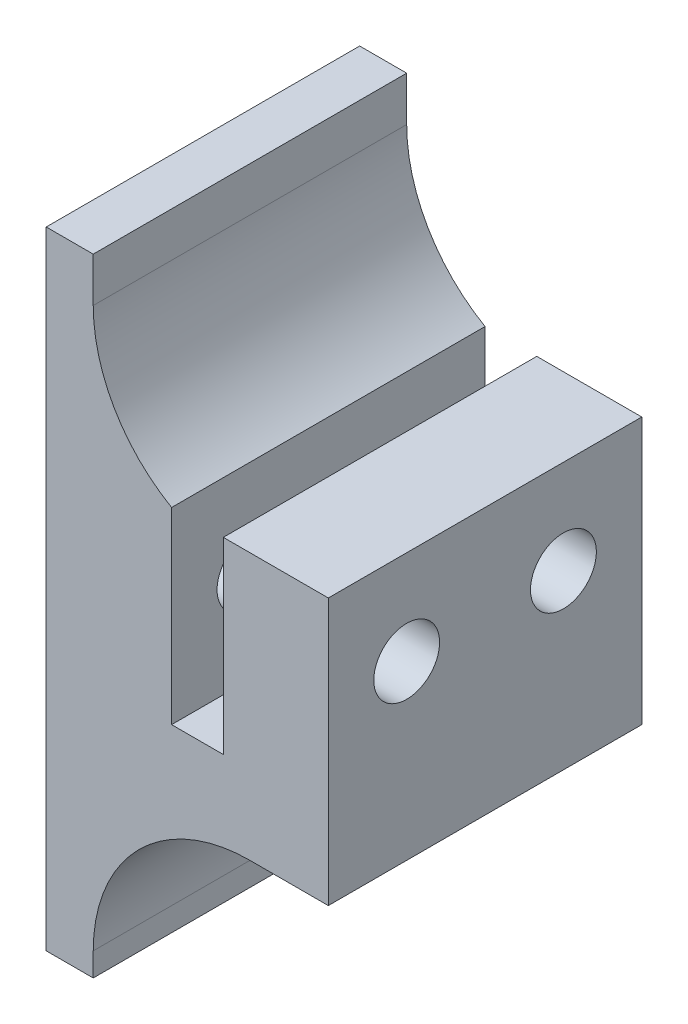
ISO-10303-21;
HEADER;
FILE_DESCRIPTION(('STEP AP214'),'2;1');
FILE_NAME('part.step','',(''),(''),'','','');
FILE_SCHEMA(('AUTOMOTIVE_DESIGN { 1 0 10303 214 1 1 1 1 }'));
ENDSEC;
DATA;
#1=APPLICATION_CONTEXT('core data for automotive mechanical design processes');
#2=APPLICATION_PROTOCOL_DEFINITION('international standard','automotive_design',2000,#1);
#3=PRODUCT_CONTEXT('',#1,'mechanical');
#4=PRODUCT('Part','Part','',(#3));
#5=PRODUCT_RELATED_PRODUCT_CATEGORY('part','',(#4));
#6=PRODUCT_DEFINITION_FORMATION('','',#4);
#7=PRODUCT_DEFINITION_CONTEXT('part definition',#1,'design');
#8=PRODUCT_DEFINITION('design','',#6,#7);
#9=PRODUCT_DEFINITION_SHAPE('','',#8);
#10=(LENGTH_UNIT() NAMED_UNIT(*) SI_UNIT(.MILLI.,.METRE.));
#11=(NAMED_UNIT(*) PLANE_ANGLE_UNIT() SI_UNIT($,.RADIAN.));
#12=(NAMED_UNIT(*) SI_UNIT($,.STERADIAN.) SOLID_ANGLE_UNIT());
#13=UNCERTAINTY_MEASURE_WITH_UNIT(LENGTH_MEASURE(1.E-05),#10,'distance_accuracy_value','');
#14=(GEOMETRIC_REPRESENTATION_CONTEXT(3) GLOBAL_UNCERTAINTY_ASSIGNED_CONTEXT((#13)) GLOBAL_UNIT_ASSIGNED_CONTEXT((#10,
#11,#12)) REPRESENTATION_CONTEXT('',''));
#15=CARTESIAN_POINT('',(0.,0.,0.));
#16=DIRECTION('',(0.,0.,1.));
#17=DIRECTION('',(1.,0.,0.));
#18=AXIS2_PLACEMENT_3D('',#15,#16,#17);
#19=CARTESIAN_POINT('',(0.,0.,20.));
#20=DIRECTION('',(-1.,0.,0.));
#21=DIRECTION('',(0.,-1.,0.));
#22=AXIS2_PLACEMENT_3D('',#19,#20,#21);
#23=PLANE('',#22);
#24=CARTESIAN_POINT('',(0.,-6.,5.));
#25=DIRECTION('',(-1.,0.,0.));
#26=DIRECTION('',(0.,-1.,0.));
#27=AXIS2_PLACEMENT_3D('',#24,#25,#26);
#28=CIRCLE('',#27,2.1);
#29=CARTESIAN_POINT('',(0.,-8.1,5.));
#30=VERTEX_POINT('',#29);
#31=EDGE_CURVE('E186',#30,#30,#28,.T.);
#32=ORIENTED_EDGE('',*,*,#31,.T.);
#33=EDGE_LOOP('',(#32));
#34=FACE_BOUND('',#33,.T.);
#35=CARTESIAN_POINT('',(0.,-6.,15.));
#36=DIRECTION('',(-1.,0.,0.));
#37=DIRECTION('',(0.,-1.,0.));
#38=AXIS2_PLACEMENT_3D('',#35,#36,#37);
#39=CIRCLE('',#38,2.1);
#40=CARTESIAN_POINT('',(0.,-8.1,15.));
#41=VERTEX_POINT('',#40);
#42=EDGE_CURVE('E166',#41,#41,#39,.T.);
#43=ORIENTED_EDGE('',*,*,#42,.T.);
#44=EDGE_LOOP('',(#43));
#45=FACE_BOUND('',#44,.T.);
#46=DIRECTION('',(0.,1.,0.));
#47=VECTOR('',#46,1.);
#48=CARTESIAN_POINT('',(0.,0.,0.));
#49=LINE('',#48,#47);
#50=CARTESIAN_POINT('',(0.,-12.,0.));
#51=VERTEX_POINT('',#50);
#52=CARTESIAN_POINT('',(0.,0.,0.));
#53=VERTEX_POINT('',#52);
#54=EDGE_CURVE('E148',#51,#53,#49,.T.);
#55=ORIENTED_EDGE('',*,*,#54,.T.);
#56=DIRECTION('',(0.,0.,-1.));
#57=VECTOR('',#56,1.);
#58=CARTESIAN_POINT('',(0.,0.,20.));
#59=LINE('',#58,#57);
#60=CARTESIAN_POINT('',(0.,0.,20.));
#61=VERTEX_POINT('',#60);
#62=EDGE_CURVE('E146',#61,#53,#59,.T.);
#63=ORIENTED_EDGE('',*,*,#62,.F.);
#64=DIRECTION('',(0.,1.,0.));
#65=VECTOR('',#64,1.);
#66=CARTESIAN_POINT('',(0.,0.,20.));
#67=LINE('',#66,#65);
#68=CARTESIAN_POINT('',(0.,-12.,20.));
#69=VERTEX_POINT('',#68);
#70=EDGE_CURVE('E134',#69,#61,#67,.T.);
#71=ORIENTED_EDGE('',*,*,#70,.F.);
#72=DIRECTION('',(0.,0.,-1.));
#73=VECTOR('',#72,1.);
#74=CARTESIAN_POINT('',(0.,-12.,20.));
#75=LINE('',#74,#73);
#76=EDGE_CURVE('E208',#69,#51,#75,.T.);
#77=ORIENTED_EDGE('',*,*,#76,.T.);
#78=EDGE_LOOP('',(#55,#63,#71,#77));
#79=FACE_BOUND('',#78,.T.);
#80=ADVANCED_FACE('F41',(#34,#45,#79),#23,.F.);
#81=CARTESIAN_POINT('',(-5.,11.5,20.));
#82=DIRECTION('',(-1.,0.,0.));
#83=DIRECTION('',(0.,0.,1.));
#84=AXIS2_PLACEMENT_3D('',#81,#82,#83);
#85=PLANE('',#84);
#86=DIRECTION('',(0.,1.,0.));
#87=VECTOR('',#86,1.);
#88=CARTESIAN_POINT('',(-5.,11.5,20.));
#89=LINE('',#88,#87);
#90=CARTESIAN_POINT('',(-5.,8.66025403784439,20.));
#91=VERTEX_POINT('',#90);
#92=CARTESIAN_POINT('',(-5.,11.5,20.));
#93=VERTEX_POINT('',#92);
#94=EDGE_CURVE('E142',#91,#93,#89,.T.);
#95=ORIENTED_EDGE('',*,*,#94,.F.);
#96=DIRECTION('',(0.,0.,-1.));
#97=VECTOR('',#96,1.);
#98=CARTESIAN_POINT('',(-5.,8.66025403784439,20.));
#99=LINE('',#98,#97);
#100=CARTESIAN_POINT('',(-5.,8.66025403784439,0.));
#101=VERTEX_POINT('',#100);
#102=EDGE_CURVE('E152',#91,#101,#99,.T.);
#103=ORIENTED_EDGE('',*,*,#102,.T.);
#104=DIRECTION('',(0.,1.,0.));
#105=VECTOR('',#104,1.);
#106=CARTESIAN_POINT('',(-5.,11.5,0.));
#107=LINE('',#106,#105);
#108=CARTESIAN_POINT('',(-5.,11.5,0.));
#109=VERTEX_POINT('',#108);
#110=EDGE_CURVE('E210',#101,#109,#107,.T.);
#111=ORIENTED_EDGE('',*,*,#110,.T.);
#112=DIRECTION('',(0.,0.,-1.));
#113=VECTOR('',#112,1.);
#114=CARTESIAN_POINT('',(-5.,11.5,20.));
#115=LINE('',#114,#113);
#116=EDGE_CURVE('E150',#93,#109,#115,.T.);
#117=ORIENTED_EDGE('',*,*,#116,.F.);
#118=EDGE_LOOP('',(#95,#103,#111,#117));
#119=FACE_BOUND('',#118,.T.);
#120=ADVANCED_FACE('F299',(#119),#85,.F.);
#121=CARTESIAN_POINT('',(-8.,11.5,20.));
#122=DIRECTION('',(0.,-1.,0.));
#123=DIRECTION('',(1.,0.,0.));
#124=AXIS2_PLACEMENT_3D('',#121,#122,#123);
#125=PLANE('',#124);
#126=DIRECTION('',(-1.,0.,0.));
#127=VECTOR('',#126,1.);
#128=CARTESIAN_POINT('',(-8.,11.5,0.));
#129=LINE('',#128,#127);
#130=CARTESIAN_POINT('',(-8.,11.5,0.));
#131=VERTEX_POINT('',#130);
#132=EDGE_CURVE('E212',#109,#131,#129,.T.);
#133=ORIENTED_EDGE('',*,*,#132,.T.);
#134=DIRECTION('',(0.,0.,-1.));
#135=VECTOR('',#134,1.);
#136=CARTESIAN_POINT('',(-8.,11.5,20.));
#137=LINE('',#136,#135);
#138=CARTESIAN_POINT('',(-8.,11.5,20.));
#139=VERTEX_POINT('',#138);
#140=EDGE_CURVE('E249',#139,#131,#137,.T.);
#141=ORIENTED_EDGE('',*,*,#140,.F.);
#142=DIRECTION('',(-1.,0.,0.));
#143=VECTOR('',#142,1.);
#144=CARTESIAN_POINT('',(-8.,11.5,20.));
#145=LINE('',#144,#143);
#146=EDGE_CURVE('E190',#93,#139,#145,.T.);
#147=ORIENTED_EDGE('',*,*,#146,.F.);
#148=ORIENTED_EDGE('',*,*,#116,.T.);
#149=EDGE_LOOP('',(#133,#141,#147,#148));
#150=FACE_BOUND('',#149,.T.);
#151=ADVANCED_FACE('F297',(#150),#125,.F.);
#152=CARTESIAN_POINT('',(-8.,-28.5,20.));
#153=DIRECTION('',(1.,0.,0.));
#154=DIRECTION('',(0.,0.,-1.));
#155=AXIS2_PLACEMENT_3D('',#152,#153,#154);
#156=PLANE('',#155);
#157=CARTESIAN_POINT('',(-8.,-6.,5.));
#158=DIRECTION('',(-1.,0.,0.));
#159=DIRECTION('',(0.,0.,1.));
#160=AXIS2_PLACEMENT_3D('',#157,#158,#159);
#161=CIRCLE('',#160,2.1);
#162=CARTESIAN_POINT('',(-8.,-6.,7.1));
#163=VERTEX_POINT('',#162);
#164=EDGE_CURVE('E173',#163,#163,#161,.T.);
#165=ORIENTED_EDGE('',*,*,#164,.F.);
#166=EDGE_LOOP('',(#165));
#167=FACE_BOUND('',#166,.T.);
#168=CARTESIAN_POINT('',(-8.,-6.,15.));
#169=DIRECTION('',(-1.,0.,0.));
#170=DIRECTION('',(0.,0.,1.));
#171=AXIS2_PLACEMENT_3D('',#168,#169,#170);
#172=CIRCLE('',#171,2.1);
#173=CARTESIAN_POINT('',(-8.,-6.,17.1));
#174=VERTEX_POINT('',#173);
#175=EDGE_CURVE('E178',#174,#174,#172,.T.);
#176=ORIENTED_EDGE('',*,*,#175,.F.);
#177=EDGE_LOOP('',(#176));
#178=FACE_BOUND('',#177,.T.);
#179=DIRECTION('',(0.,-1.,0.));
#180=VECTOR('',#179,1.);
#181=CARTESIAN_POINT('',(-8.,-28.5,0.));
#182=LINE('',#181,#180);
#183=CARTESIAN_POINT('',(-8.,-28.5,0.));
#184=VERTEX_POINT('',#183);
#185=EDGE_CURVE('E214',#131,#184,#182,.T.);
#186=ORIENTED_EDGE('',*,*,#185,.T.);
#187=DIRECTION('',(0.,0.,-1.));
#188=VECTOR('',#187,1.);
#189=CARTESIAN_POINT('',(-8.,-28.5,20.));
#190=LINE('',#189,#188);
#191=CARTESIAN_POINT('',(-8.,-28.5,20.));
#192=VERTEX_POINT('',#191);
#193=EDGE_CURVE('E246',#192,#184,#190,.T.);
#194=ORIENTED_EDGE('',*,*,#193,.F.);
#195=DIRECTION('',(0.,-1.,0.));
#196=VECTOR('',#195,1.);
#197=CARTESIAN_POINT('',(-8.,-28.5,20.));
#198=LINE('',#197,#196);
#199=EDGE_CURVE('E192',#139,#192,#198,.T.);
#200=ORIENTED_EDGE('',*,*,#199,.F.);
#201=ORIENTED_EDGE('',*,*,#140,.T.);
#202=EDGE_LOOP('',(#186,#194,#200,#201));
#203=FACE_BOUND('',#202,.T.);
#204=ADVANCED_FACE('F293',(#167,#178,#203),#156,.F.);
#205=CARTESIAN_POINT('',(-5.,-28.5,20.));
#206=DIRECTION('',(0.,1.,0.));
#207=DIRECTION('',(0.,0.,1.));
#208=AXIS2_PLACEMENT_3D('',#205,#206,#207);
#209=PLANE('',#208);
#210=DIRECTION('',(1.,0.,0.));
#211=VECTOR('',#210,1.);
#212=CARTESIAN_POINT('',(-5.,-28.5,0.));
#213=LINE('',#212,#211);
#214=CARTESIAN_POINT('',(-5.,-28.5,0.));
#215=VERTEX_POINT('',#214);
#216=EDGE_CURVE('E216',#184,#215,#213,.T.);
#217=ORIENTED_EDGE('',*,*,#216,.T.);
#218=DIRECTION('',(0.,0.,-1.));
#219=VECTOR('',#218,1.);
#220=CARTESIAN_POINT('',(-5.,-28.5,20.));
#221=LINE('',#220,#219);
#222=CARTESIAN_POINT('',(-5.,-28.5,20.));
#223=VERTEX_POINT('',#222);
#224=EDGE_CURVE('E243',#223,#215,#221,.T.);
#225=ORIENTED_EDGE('',*,*,#224,.F.);
#226=DIRECTION('',(1.,0.,0.));
#227=VECTOR('',#226,1.);
#228=CARTESIAN_POINT('',(-5.,-28.5,20.));
#229=LINE('',#228,#227);
#230=EDGE_CURVE('E194',#192,#223,#229,.T.);
#231=ORIENTED_EDGE('',*,*,#230,.F.);
#232=ORIENTED_EDGE('',*,*,#193,.T.);
#233=EDGE_LOOP('',(#217,#225,#231,#232));
#234=FACE_BOUND('',#233,.T.);
#235=ADVANCED_FACE('F288',(#234),#209,.F.);
#236=CARTESIAN_POINT('',(-5.,-17.,20.));
#237=DIRECTION('',(-1.,0.,0.));
#238=DIRECTION('',(0.,0.,1.));
#239=AXIS2_PLACEMENT_3D('',#236,#237,#238);
#240=PLANE('',#239);
#241=DIRECTION('',(0.,1.,0.));
#242=VECTOR('',#241,1.);
#243=CARTESIAN_POINT('',(-5.,-17.,0.));
#244=LINE('',#243,#242);
#245=CARTESIAN_POINT('',(-5.,-27.,0.));
#246=VERTEX_POINT('',#245);
#247=EDGE_CURVE('E218',#215,#246,#244,.T.);
#248=ORIENTED_EDGE('',*,*,#247,.T.);
#249=DIRECTION('',(0.,0.,-1.));
#250=VECTOR('',#249,1.);
#251=CARTESIAN_POINT('',(-5.,-27.,20.));
#252=LINE('',#251,#250);
#253=CARTESIAN_POINT('',(-5.,-27.,20.));
#254=VERTEX_POINT('',#253);
#255=EDGE_CURVE('E156',#246,#254,#252,.F.);
#256=ORIENTED_EDGE('',*,*,#255,.T.);
#257=DIRECTION('',(0.,1.,0.));
#258=VECTOR('',#257,1.);
#259=CARTESIAN_POINT('',(-5.,-17.,20.));
#260=LINE('',#259,#258);
#261=EDGE_CURVE('E196',#223,#254,#260,.T.);
#262=ORIENTED_EDGE('',*,*,#261,.F.);
#263=ORIENTED_EDGE('',*,*,#224,.T.);
#264=EDGE_LOOP('',(#248,#256,#262,#263));
#265=FACE_BOUND('',#264,.T.);
#266=ADVANCED_FACE('F282',(#265),#240,.F.);
#267=CARTESIAN_POINT('',(10.,-17.,20.));
#268=DIRECTION('',(0.,1.,0.));
#269=DIRECTION('',(-1.,0.,0.));
#270=AXIS2_PLACEMENT_3D('',#267,#268,#269);
#271=PLANE('',#270);
#272=DIRECTION('',(1.,0.,0.));
#273=VECTOR('',#272,1.);
#274=CARTESIAN_POINT('',(0.,-17.,20.));
#275=LINE('',#274,#273);
#276=CARTESIAN_POINT('',(5.,-17.,20.));
#277=VERTEX_POINT('',#276);
#278=CARTESIAN_POINT('',(10.,-17.,20.));
#279=VERTEX_POINT('',#278);
#280=EDGE_CURVE('E199',#277,#279,#275,.T.);
#281=ORIENTED_EDGE('',*,*,#280,.F.);
#282=DIRECTION('',(0.,0.,-1.));
#283=VECTOR('',#282,1.);
#284=CARTESIAN_POINT('',(5.,-17.,0.));
#285=LINE('',#284,#283);
#286=CARTESIAN_POINT('',(5.,-17.,0.));
#287=VERTEX_POINT('',#286);
#288=EDGE_CURVE('E149',#277,#287,#285,.T.);
#289=ORIENTED_EDGE('',*,*,#288,.T.);
#290=DIRECTION('',(1.,0.,0.));
#291=VECTOR('',#290,1.);
#292=CARTESIAN_POINT('',(10.,-17.,0.));
#293=LINE('',#292,#291);
#294=CARTESIAN_POINT('',(10.,-17.,0.));
#295=VERTEX_POINT('',#294);
#296=EDGE_CURVE('E221',#287,#295,#293,.T.);
#297=ORIENTED_EDGE('',*,*,#296,.T.);
#298=DIRECTION('',(0.,0.,-1.));
#299=VECTOR('',#298,1.);
#300=CARTESIAN_POINT('',(10.,-17.,20.));
#301=LINE('',#300,#299);
#302=EDGE_CURVE('E240',#279,#295,#301,.T.);
#303=ORIENTED_EDGE('',*,*,#302,.F.);
#304=EDGE_LOOP('',(#281,#289,#297,#303));
#305=FACE_BOUND('',#304,.T.);
#306=ADVANCED_FACE('F258',(#305),#271,.F.);
#307=CARTESIAN_POINT('',(10.,0.,20.));
#308=DIRECTION('',(-1.,0.,0.));
#309=DIRECTION('',(0.,-1.,0.));
#310=AXIS2_PLACEMENT_3D('',#307,#308,#309);
#311=PLANE('',#310);
#312=CARTESIAN_POINT('',(10.,-6.,5.));
#313=DIRECTION('',(-1.,0.,0.));
#314=DIRECTION('',(0.,0.,1.));
#315=AXIS2_PLACEMENT_3D('',#312,#313,#314);
#316=CIRCLE('',#315,2.1);
#317=CARTESIAN_POINT('',(10.,-6.,7.1));
#318=VERTEX_POINT('',#317);
#319=EDGE_CURVE('E167',#318,#318,#316,.T.);
#320=ORIENTED_EDGE('',*,*,#319,.T.);
#321=EDGE_LOOP('',(#320));
#322=FACE_BOUND('',#321,.T.);
#323=CARTESIAN_POINT('',(10.,-6.,15.));
#324=DIRECTION('',(-1.,0.,0.));
#325=DIRECTION('',(0.,0.,1.));
#326=AXIS2_PLACEMENT_3D('',#323,#324,#325);
#327=CIRCLE('',#326,2.1);
#328=CARTESIAN_POINT('',(10.,-6.,17.1));
#329=VERTEX_POINT('',#328);
#330=EDGE_CURVE('E183',#329,#329,#327,.T.);
#331=ORIENTED_EDGE('',*,*,#330,.T.);
#332=EDGE_LOOP('',(#331));
#333=FACE_BOUND('',#332,.T.);
#334=DIRECTION('',(0.,1.,0.));
#335=VECTOR('',#334,1.);
#336=CARTESIAN_POINT('',(10.,0.,0.));
#337=LINE('',#336,#335);
#338=CARTESIAN_POINT('',(10.,0.,0.));
#339=VERTEX_POINT('',#338);
#340=EDGE_CURVE('E223',#295,#339,#337,.T.);
#341=ORIENTED_EDGE('',*,*,#340,.T.);
#342=DIRECTION('',(0.,0.,-1.));
#343=VECTOR('',#342,1.);
#344=CARTESIAN_POINT('',(10.,0.,20.));
#345=LINE('',#344,#343);
#346=CARTESIAN_POINT('',(10.,0.,20.));
#347=VERTEX_POINT('',#346);
#348=EDGE_CURVE('E237',#347,#339,#345,.T.);
#349=ORIENTED_EDGE('',*,*,#348,.F.);
#350=DIRECTION('',(0.,1.,0.));
#351=VECTOR('',#350,1.);
#352=CARTESIAN_POINT('',(10.,0.,20.));
#353=LINE('',#352,#351);
#354=EDGE_CURVE('E201',#279,#347,#353,.T.);
#355=ORIENTED_EDGE('',*,*,#354,.F.);
#356=ORIENTED_EDGE('',*,*,#302,.T.);
#357=EDGE_LOOP('',(#341,#349,#355,#356));
#358=FACE_BOUND('',#357,.T.);
#359=ADVANCED_FACE('F270',(#322,#333,#358),#311,.F.);
#360=CARTESIAN_POINT('',(3.3,0.,20.));
#361=DIRECTION('',(0.,-1.,0.));
#362=DIRECTION('',(0.,0.,-1.));
#363=AXIS2_PLACEMENT_3D('',#360,#361,#362);
#364=PLANE('',#363);
#365=DIRECTION('',(-1.,0.,0.));
#366=VECTOR('',#365,1.);
#367=CARTESIAN_POINT('',(3.3,0.,0.));
#368=LINE('',#367,#366);
#369=CARTESIAN_POINT('',(3.3,0.,0.));
#370=VERTEX_POINT('',#369);
#371=EDGE_CURVE('E225',#339,#370,#368,.T.);
#372=ORIENTED_EDGE('',*,*,#371,.T.);
#373=DIRECTION('',(0.,0.,-1.));
#374=VECTOR('',#373,1.);
#375=CARTESIAN_POINT('',(3.3,0.,20.));
#376=LINE('',#375,#374);
#377=CARTESIAN_POINT('',(3.3,0.,20.));
#378=VERTEX_POINT('',#377);
#379=EDGE_CURVE('E234',#378,#370,#376,.T.);
#380=ORIENTED_EDGE('',*,*,#379,.F.);
#381=DIRECTION('',(-1.,0.,0.));
#382=VECTOR('',#381,1.);
#383=CARTESIAN_POINT('',(3.3,0.,20.));
#384=LINE('',#383,#382);
#385=EDGE_CURVE('E203',#347,#378,#384,.T.);
#386=ORIENTED_EDGE('',*,*,#385,.F.);
#387=ORIENTED_EDGE('',*,*,#348,.T.);
#388=EDGE_LOOP('',(#372,#380,#386,#387));
#389=FACE_BOUND('',#388,.T.);
#390=ADVANCED_FACE('F274',(#389),#364,.F.);
#391=CARTESIAN_POINT('',(3.3,-12.,20.));
#392=DIRECTION('',(1.,0.,0.));
#393=DIRECTION('',(0.,1.,0.));
#394=AXIS2_PLACEMENT_3D('',#391,#392,#393);
#395=PLANE('',#394);
#396=CARTESIAN_POINT('',(3.3,-6.,5.));
#397=DIRECTION('',(1.,0.,0.));
#398=DIRECTION('',(0.,1.,0.));
#399=AXIS2_PLACEMENT_3D('',#396,#397,#398);
#400=CIRCLE('',#399,2.1);
#401=CARTESIAN_POINT('',(3.3,-3.9,5.));
#402=VERTEX_POINT('',#401);
#403=EDGE_CURVE('E45',#402,#402,#400,.T.);
#404=ORIENTED_EDGE('',*,*,#403,.T.);
#405=EDGE_LOOP('',(#404));
#406=FACE_BOUND('',#405,.T.);
#407=CARTESIAN_POINT('',(3.3,-6.,15.));
#408=DIRECTION('',(1.,0.,0.));
#409=DIRECTION('',(0.,1.,0.));
#410=AXIS2_PLACEMENT_3D('',#407,#408,#409);
#411=CIRCLE('',#410,2.1);
#412=CARTESIAN_POINT('',(3.3,-3.9,15.));
#413=VERTEX_POINT('',#412);
#414=EDGE_CURVE('E164',#413,#413,#411,.T.);
#415=ORIENTED_EDGE('',*,*,#414,.T.);
#416=EDGE_LOOP('',(#415));
#417=FACE_BOUND('',#416,.T.);
#418=DIRECTION('',(0.,-1.,0.));
#419=VECTOR('',#418,1.);
#420=CARTESIAN_POINT('',(3.3,-12.,0.));
#421=LINE('',#420,#419);
#422=CARTESIAN_POINT('',(3.3,-12.,0.));
#423=VERTEX_POINT('',#422);
#424=EDGE_CURVE('E227',#370,#423,#421,.T.);
#425=ORIENTED_EDGE('',*,*,#424,.T.);
#426=DIRECTION('',(0.,0.,-1.));
#427=VECTOR('',#426,1.);
#428=CARTESIAN_POINT('',(3.3,-12.,20.));
#429=LINE('',#428,#427);
#430=CARTESIAN_POINT('',(3.3,-12.,20.));
#431=VERTEX_POINT('',#430);
#432=EDGE_CURVE('E231',#431,#423,#429,.T.);
#433=ORIENTED_EDGE('',*,*,#432,.F.);
#434=DIRECTION('',(0.,-1.,0.));
#435=VECTOR('',#434,1.);
#436=CARTESIAN_POINT('',(3.3,-12.,20.));
#437=LINE('',#436,#435);
#438=EDGE_CURVE('E205',#378,#431,#437,.T.);
#439=ORIENTED_EDGE('',*,*,#438,.F.);
#440=ORIENTED_EDGE('',*,*,#379,.T.);
#441=EDGE_LOOP('',(#425,#433,#439,#440));
#442=FACE_BOUND('',#441,.T.);
#443=ADVANCED_FACE('F327',(#406,#417,#442),#395,.F.);
#444=CARTESIAN_POINT('',(0.,-12.,20.));
#445=DIRECTION('',(0.,-1.,0.));
#446=DIRECTION('',(0.,0.,-1.));
#447=AXIS2_PLACEMENT_3D('',#444,#445,#446);
#448=PLANE('',#447);
#449=DIRECTION('',(-1.,0.,0.));
#450=VECTOR('',#449,1.);
#451=CARTESIAN_POINT('',(0.,-12.,0.));
#452=LINE('',#451,#450);
#453=EDGE_CURVE('E143',#423,#51,#452,.T.);
#454=ORIENTED_EDGE('',*,*,#453,.T.);
#455=ORIENTED_EDGE('',*,*,#76,.F.);
#456=DIRECTION('',(-1.,0.,0.));
#457=VECTOR('',#456,1.);
#458=CARTESIAN_POINT('',(0.,-12.,20.));
#459=LINE('',#458,#457);
#460=EDGE_CURVE('E138',#431,#69,#459,.T.);
#461=ORIENTED_EDGE('',*,*,#460,.F.);
#462=ORIENTED_EDGE('',*,*,#432,.T.);
#463=EDGE_LOOP('',(#454,#455,#461,#462));
#464=FACE_BOUND('',#463,.T.);
#465=ADVANCED_FACE('F322',(#464),#448,.F.);
#466=CARTESIAN_POINT('',(0.,0.,20.));
#467=DIRECTION('',(0.,0.,1.));
#468=DIRECTION('',(1.,0.,0.));
#469=AXIS2_PLACEMENT_3D('',#466,#467,#468);
#470=PLANE('',#469);
#471=ORIENTED_EDGE('',*,*,#70,.T.);
#472=CARTESIAN_POINT('',(5.,8.66025403784439,20.));
#473=DIRECTION('',(0.,0.,1.));
#474=DIRECTION('',(1.,0.,0.));
#475=AXIS2_PLACEMENT_3D('',#472,#473,#474);
#476=CIRCLE('',#475,10.);
#477=EDGE_CURVE('E11',#61,#91,#476,.F.);
#478=ORIENTED_EDGE('',*,*,#477,.T.);
#479=ORIENTED_EDGE('',*,*,#94,.T.);
#480=ORIENTED_EDGE('',*,*,#146,.T.);
#481=ORIENTED_EDGE('',*,*,#199,.T.);
#482=ORIENTED_EDGE('',*,*,#230,.T.);
#483=ORIENTED_EDGE('',*,*,#261,.T.);
#484=CARTESIAN_POINT('',(5.,-27.,20.));
#485=DIRECTION('',(0.,0.,1.));
#486=DIRECTION('',(1.,0.,0.));
#487=AXIS2_PLACEMENT_3D('',#484,#485,#486);
#488=CIRCLE('',#487,10.);
#489=EDGE_CURVE('E158',#254,#277,#488,.F.);
#490=ORIENTED_EDGE('',*,*,#489,.T.);
#491=ORIENTED_EDGE('',*,*,#280,.T.);
#492=ORIENTED_EDGE('',*,*,#354,.T.);
#493=ORIENTED_EDGE('',*,*,#385,.T.);
#494=ORIENTED_EDGE('',*,*,#438,.T.);
#495=ORIENTED_EDGE('',*,*,#460,.T.);
#496=EDGE_LOOP('',(#471,#478,#479,#480,#481,#482,#483,#490,#491,#492,#493,#494,#495));
#497=FACE_BOUND('',#496,.T.);
#498=ADVANCED_FACE('F136',(#497),#470,.T.);
#499=CARTESIAN_POINT('',(0.,0.,0.));
#500=DIRECTION('',(0.,0.,1.));
#501=DIRECTION('',(1.,0.,0.));
#502=AXIS2_PLACEMENT_3D('',#499,#500,#501);
#503=PLANE('',#502);
#504=ORIENTED_EDGE('',*,*,#54,.F.);
#505=ORIENTED_EDGE('',*,*,#453,.F.);
#506=ORIENTED_EDGE('',*,*,#424,.F.);
#507=ORIENTED_EDGE('',*,*,#371,.F.);
#508=ORIENTED_EDGE('',*,*,#340,.F.);
#509=ORIENTED_EDGE('',*,*,#296,.F.);
#510=CARTESIAN_POINT('',(5.,-27.,0.));
#511=DIRECTION('',(0.,0.,1.));
#512=DIRECTION('',(1.,0.,0.));
#513=AXIS2_PLACEMENT_3D('',#510,#511,#512);
#514=CIRCLE('',#513,10.);
#515=EDGE_CURVE('E155',#287,#246,#514,.T.);
#516=ORIENTED_EDGE('',*,*,#515,.T.);
#517=ORIENTED_EDGE('',*,*,#247,.F.);
#518=ORIENTED_EDGE('',*,*,#216,.F.);
#519=ORIENTED_EDGE('',*,*,#185,.F.);
#520=ORIENTED_EDGE('',*,*,#132,.F.);
#521=ORIENTED_EDGE('',*,*,#110,.F.);
#522=CARTESIAN_POINT('',(5.,8.66025403784439,0.));
#523=DIRECTION('',(0.,0.,1.));
#524=DIRECTION('',(1.,0.,0.));
#525=AXIS2_PLACEMENT_3D('',#522,#523,#524);
#526=CIRCLE('',#525,10.);
#527=EDGE_CURVE('E50',#101,#53,#526,.T.);
#528=ORIENTED_EDGE('',*,*,#527,.T.);
#529=EDGE_LOOP('',(#504,#505,#506,#507,#508,#509,#516,#517,#518,#519,#520,#521,#528));
#530=FACE_BOUND('',#529,.T.);
#531=ADVANCED_FACE('F264',(#530),#503,.F.);
#532=CARTESIAN_POINT('',(5.,-27.,20.));
#533=DIRECTION('',(0.,0.,1.));
#534=DIRECTION('',(1.,0.,0.));
#535=AXIS2_PLACEMENT_3D('',#532,#533,#534);
#536=CYLINDRICAL_SURFACE('',#535,10.);
#537=ORIENTED_EDGE('',*,*,#489,.F.);
#538=ORIENTED_EDGE('',*,*,#255,.F.);
#539=ORIENTED_EDGE('',*,*,#515,.F.);
#540=ORIENTED_EDGE('',*,*,#288,.F.);
#541=EDGE_LOOP('',(#537,#538,#539,#540));
#542=FACE_BOUND('',#541,.T.);
#543=ADVANCED_FACE('F280',(#542),#536,.F.);
#544=CARTESIAN_POINT('',(5.,8.66025403784439,20.));
#545=DIRECTION('',(0.,0.,-1.));
#546=DIRECTION('',(-1.,0.,0.));
#547=AXIS2_PLACEMENT_3D('',#544,#545,#546);
#548=CYLINDRICAL_SURFACE('',#547,10.);
#549=ORIENTED_EDGE('',*,*,#477,.F.);
#550=ORIENTED_EDGE('',*,*,#62,.T.);
#551=ORIENTED_EDGE('',*,*,#527,.F.);
#552=ORIENTED_EDGE('',*,*,#102,.F.);
#553=EDGE_LOOP('',(#549,#550,#551,#552));
#554=FACE_BOUND('',#553,.T.);
#555=ADVANCED_FACE('F43',(#554),#548,.F.);
#556=CARTESIAN_POINT('',(10.,-6.,15.));
#557=DIRECTION('',(-1.,0.,0.));
#558=DIRECTION('',(0.,0.,1.));
#559=AXIS2_PLACEMENT_3D('',#556,#557,#558);
#560=CYLINDRICAL_SURFACE('',#559,2.1);
#561=ORIENTED_EDGE('',*,*,#330,.F.);
#562=EDGE_LOOP('',(#561));
#563=FACE_BOUND('',#562,.T.);
#564=ORIENTED_EDGE('',*,*,#414,.F.);
#565=EDGE_LOOP('',(#564));
#566=FACE_BOUND('',#565,.T.);
#567=ADVANCED_FACE('F317',(#563,#566),#560,.F.);
#568=CARTESIAN_POINT('',(10.,-6.,5.));
#569=DIRECTION('',(-1.,0.,0.));
#570=DIRECTION('',(0.,0.,1.));
#571=AXIS2_PLACEMENT_3D('',#568,#569,#570);
#572=CYLINDRICAL_SURFACE('',#571,2.1);
#573=ORIENTED_EDGE('',*,*,#319,.F.);
#574=EDGE_LOOP('',(#573));
#575=FACE_BOUND('',#574,.T.);
#576=ORIENTED_EDGE('',*,*,#403,.F.);
#577=EDGE_LOOP('',(#576));
#578=FACE_BOUND('',#577,.T.);
#579=ADVANCED_FACE('F352',(#575,#578),#572,.F.);
#580=ORIENTED_EDGE('',*,*,#175,.T.);
#581=EDGE_LOOP('',(#580));
#582=FACE_BOUND('',#581,.T.);
#583=ORIENTED_EDGE('',*,*,#42,.F.);
#584=EDGE_LOOP('',(#583));
#585=FACE_BOUND('',#584,.T.);
#586=ADVANCED_FACE('F348',(#582,#585),#560,.F.);
#587=ORIENTED_EDGE('',*,*,#164,.T.);
#588=EDGE_LOOP('',(#587));
#589=FACE_BOUND('',#588,.T.);
#590=ORIENTED_EDGE('',*,*,#31,.F.);
#591=EDGE_LOOP('',(#590));
#592=FACE_BOUND('',#591,.T.);
#593=ADVANCED_FACE('F351',(#589,#592),#572,.F.);
#594=CLOSED_SHELL('',(#80,#120,#151,#204,#235,#266,#306,#359,#390,#443,#465,#498,#531,#543,#555,
#567,#579,#586,#593));
#595=MANIFOLD_SOLID_BREP('B2',#594);
#596=ADVANCED_BREP_SHAPE_REPRESENTATION('',(#18,#595),#14);
#597=SHAPE_DEFINITION_REPRESENTATION(#9,#596);
ENDSEC;
END-ISO-10303-21;
